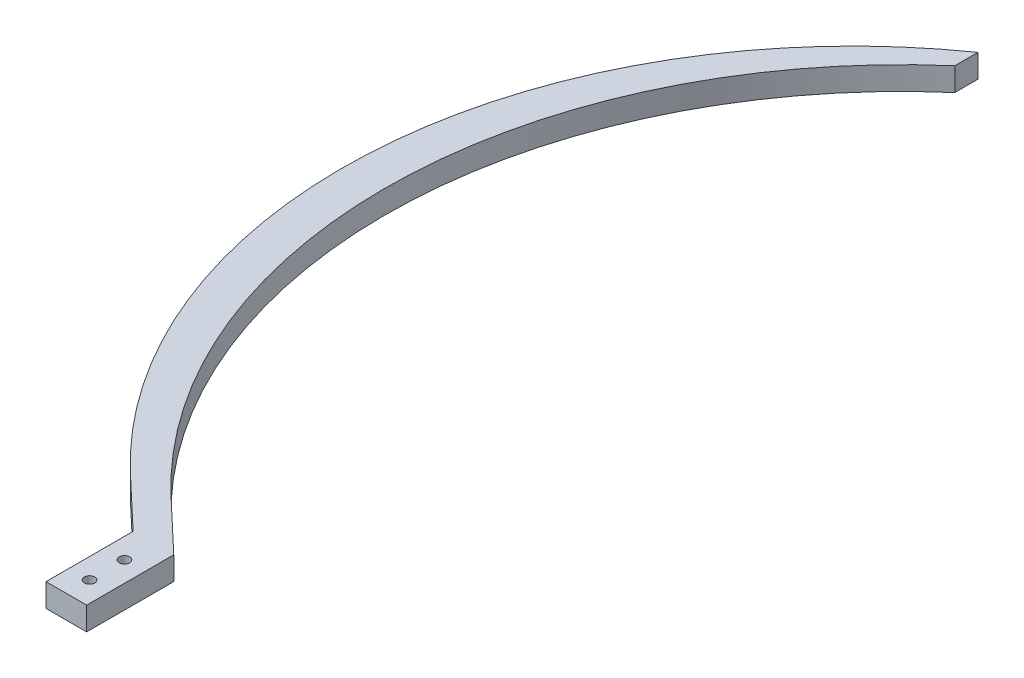
ISO-10303-21;
HEADER;
FILE_DESCRIPTION(('STEP AP214'),'2;1');
FILE_NAME('part.step','',(''),(''),'','','');
FILE_SCHEMA(('AUTOMOTIVE_DESIGN { 1 0 10303 214 1 1 1 1 }'));
ENDSEC;
DATA;
#1=APPLICATION_CONTEXT('core data for automotive mechanical design processes');
#2=APPLICATION_PROTOCOL_DEFINITION('international standard','automotive_design',2000,#1);
#3=PRODUCT_CONTEXT('',#1,'mechanical');
#4=PRODUCT('Part','Part','',(#3));
#5=PRODUCT_RELATED_PRODUCT_CATEGORY('part','',(#4));
#6=PRODUCT_DEFINITION_FORMATION('','',#4);
#7=PRODUCT_DEFINITION_CONTEXT('part definition',#1,'design');
#8=PRODUCT_DEFINITION('design','',#6,#7);
#9=PRODUCT_DEFINITION_SHAPE('','',#8);
#10=(LENGTH_UNIT() NAMED_UNIT(*) SI_UNIT(.MILLI.,.METRE.));
#11=(NAMED_UNIT(*) PLANE_ANGLE_UNIT() SI_UNIT($,.RADIAN.));
#12=(NAMED_UNIT(*) SI_UNIT($,.STERADIAN.) SOLID_ANGLE_UNIT());
#13=UNCERTAINTY_MEASURE_WITH_UNIT(LENGTH_MEASURE(1.E-05),#10,'distance_accuracy_value','');
#14=(GEOMETRIC_REPRESENTATION_CONTEXT(3) GLOBAL_UNCERTAINTY_ASSIGNED_CONTEXT((#13)) GLOBAL_UNIT_ASSIGNED_CONTEXT((#10,
#11,#12)) REPRESENTATION_CONTEXT('',''));
#15=CARTESIAN_POINT('',(0.,0.,0.));
#16=DIRECTION('',(0.,0.,1.));
#17=DIRECTION('',(1.,0.,0.));
#18=AXIS2_PLACEMENT_3D('',#15,#16,#17);
#19=CARTESIAN_POINT('',(48.3233544557668,4.,-79.6272482003296));
#20=DIRECTION('',(0.,-1.,0.));
#21=DIRECTION('',(0.,0.,-1.));
#22=AXIS2_PLACEMENT_3D('',#19,#20,#21);
#23=CYLINDRICAL_SURFACE('',#22,88.);
#24=CARTESIAN_POINT('',(48.3233544557668,0.,-79.6272482003296));
#25=DIRECTION('',(0.,1.,0.));
#26=DIRECTION('',(0.,0.,1.));
#27=AXIS2_PLACEMENT_3D('',#24,#25,#26);
#28=CIRCLE('',#27,88.);
#29=CARTESIAN_POINT('',(-12.2099151949693,0.,-15.7545367705549));
#30=VERTEX_POINT('',#29);
#31=CARTESIAN_POINT('',(-2.18782967453397,0.,-151.687086374966));
#32=VERTEX_POINT('',#31);
#33=EDGE_CURVE('E130',#30,#32,#28,.F.);
#34=ORIENTED_EDGE('',*,*,#33,.F.);
#35=DIRECTION('',(0.,-1.,0.));
#36=VECTOR('',#35,1.);
#37=CARTESIAN_POINT('',(-12.2099151949693,4.,-15.7545367705549));
#38=LINE('',#37,#36);
#39=CARTESIAN_POINT('',(-12.2099151949693,4.,-15.7545367705549));
#40=VERTEX_POINT('',#39);
#41=EDGE_CURVE('E11',#40,#30,#38,.T.);
#42=ORIENTED_EDGE('',*,*,#41,.F.);
#43=CARTESIAN_POINT('',(48.3233544557668,4.,-79.6272482003296));
#44=DIRECTION('',(0.,1.,0.));
#45=DIRECTION('',(0.,0.,1.));
#46=AXIS2_PLACEMENT_3D('',#43,#44,#45);
#47=CIRCLE('',#46,88.);
#48=CARTESIAN_POINT('',(-2.18782967453397,4.,-151.687086374966));
#49=VERTEX_POINT('',#48);
#50=EDGE_CURVE('E150',#40,#49,#47,.F.);
#51=ORIENTED_EDGE('',*,*,#50,.T.);
#52=DIRECTION('',(0.,-1.,0.));
#53=VECTOR('',#52,1.);
#54=CARTESIAN_POINT('',(-2.18782967453397,4.,-151.687086374966));
#55=LINE('',#54,#53);
#56=EDGE_CURVE('E53',#49,#32,#55,.T.);
#57=ORIENTED_EDGE('',*,*,#56,.T.);
#58=EDGE_LOOP('',(#34,#42,#51,#57));
#59=FACE_BOUND('',#58,.T.);
#60=ADVANCED_FACE('F35',(#59),#23,.T.);
#61=CARTESIAN_POINT('',(2.08848294307025,4.,-2.20369838137614));
#62=DIRECTION('',(-0.68787806421291,0.,0.72582626624744));
#63=DIRECTION('',(0.72582626624744,0.,0.68787806421291));
#64=AXIS2_PLACEMENT_3D('',#61,#62,#63);
#65=PLANE('',#64);
#66=DIRECTION('',(-0.72582626624744,0.,-0.68787806421291));
#67=VECTOR('',#66,1.);
#68=CARTESIAN_POINT('',(2.08848294307025,0.,-2.20369838137614));
#69=LINE('',#68,#67);
#70=CARTESIAN_POINT('',(-3.5,0.,-7.5));
#71=VERTEX_POINT('',#70);
#72=EDGE_CURVE('E132',#71,#30,#69,.T.);
#73=ORIENTED_EDGE('',*,*,#72,.F.);
#74=DIRECTION('',(0.,-1.,0.));
#75=VECTOR('',#74,1.);
#76=CARTESIAN_POINT('',(-3.5,4.,-7.5));
#77=LINE('',#76,#75);
#78=CARTESIAN_POINT('',(-3.5,4.,-7.5));
#79=VERTEX_POINT('',#78);
#80=EDGE_CURVE('E44',#79,#71,#77,.T.);
#81=ORIENTED_EDGE('',*,*,#80,.F.);
#82=DIRECTION('',(-0.72582626624744,0.,-0.68787806421291));
#83=VECTOR('',#82,1.);
#84=CARTESIAN_POINT('',(2.08848294307025,4.,-2.20369838137614));
#85=LINE('',#84,#83);
#86=EDGE_CURVE('E173',#79,#40,#85,.T.);
#87=ORIENTED_EDGE('',*,*,#86,.T.);
#88=ORIENTED_EDGE('',*,*,#41,.T.);
#89=EDGE_LOOP('',(#73,#81,#87,#88));
#90=FACE_BOUND('',#89,.T.);
#91=ADVANCED_FACE('F199',(#90),#65,.T.);
#92=CARTESIAN_POINT('',(-3.5,4.,0.));
#93=DIRECTION('',(1.,0.,0.));
#94=DIRECTION('',(0.,0.,-1.));
#95=AXIS2_PLACEMENT_3D('',#92,#93,#94);
#96=PLANE('',#95);
#97=DIRECTION('',(0.,0.,1.));
#98=VECTOR('',#97,1.);
#99=CARTESIAN_POINT('',(-3.5,0.,0.));
#100=LINE('',#99,#98);
#101=CARTESIAN_POINT('',(-3.5,0.,7.5));
#102=VERTEX_POINT('',#101);
#103=EDGE_CURVE('E135',#71,#102,#100,.T.);
#104=ORIENTED_EDGE('',*,*,#103,.T.);
#105=DIRECTION('',(0.,-1.,0.));
#106=VECTOR('',#105,1.);
#107=CARTESIAN_POINT('',(-3.5,4.,7.5));
#108=LINE('',#107,#106);
#109=CARTESIAN_POINT('',(-3.5,4.,7.5));
#110=VERTEX_POINT('',#109);
#111=EDGE_CURVE('E156',#110,#102,#108,.T.);
#112=ORIENTED_EDGE('',*,*,#111,.F.);
#113=DIRECTION('',(0.,0.,1.));
#114=VECTOR('',#113,1.);
#115=CARTESIAN_POINT('',(-3.5,4.,0.));
#116=LINE('',#115,#114);
#117=EDGE_CURVE('E176',#79,#110,#116,.T.);
#118=ORIENTED_EDGE('',*,*,#117,.F.);
#119=ORIENTED_EDGE('',*,*,#80,.T.);
#120=EDGE_LOOP('',(#104,#112,#118,#119));
#121=FACE_BOUND('',#120,.T.);
#122=ADVANCED_FACE('F203',(#121),#96,.F.);
#123=CARTESIAN_POINT('',(0.,4.,7.5));
#124=DIRECTION('',(0.,0.,1.));
#125=DIRECTION('',(1.,0.,0.));
#126=AXIS2_PLACEMENT_3D('',#123,#124,#125);
#127=PLANE('',#126);
#128=DIRECTION('',(-1.,0.,0.));
#129=VECTOR('',#128,1.);
#130=CARTESIAN_POINT('',(0.,0.,7.5));
#131=LINE('',#130,#129);
#132=CARTESIAN_POINT('',(3.5,0.,7.5));
#133=VERTEX_POINT('',#132);
#134=EDGE_CURVE('E138',#133,#102,#131,.T.);
#135=ORIENTED_EDGE('',*,*,#134,.F.);
#136=DIRECTION('',(0.,-1.,0.));
#137=VECTOR('',#136,1.);
#138=CARTESIAN_POINT('',(3.5,4.,7.5));
#139=LINE('',#138,#137);
#140=CARTESIAN_POINT('',(3.5,4.,7.5));
#141=VERTEX_POINT('',#140);
#142=EDGE_CURVE('E154',#141,#133,#139,.T.);
#143=ORIENTED_EDGE('',*,*,#142,.F.);
#144=DIRECTION('',(-1.,0.,0.));
#145=VECTOR('',#144,1.);
#146=CARTESIAN_POINT('',(0.,4.,7.5));
#147=LINE('',#146,#145);
#148=EDGE_CURVE('E178',#141,#110,#147,.T.);
#149=ORIENTED_EDGE('',*,*,#148,.T.);
#150=ORIENTED_EDGE('',*,*,#111,.T.);
#151=EDGE_LOOP('',(#135,#143,#149,#150));
#152=FACE_BOUND('',#151,.T.);
#153=ADVANCED_FACE('F212',(#152),#127,.T.);
#154=CARTESIAN_POINT('',(3.5,4.,0.));
#155=DIRECTION('',(1.,0.,0.));
#156=DIRECTION('',(0.,0.,-1.));
#157=AXIS2_PLACEMENT_3D('',#154,#155,#156);
#158=PLANE('',#157);
#159=DIRECTION('',(0.,0.,1.));
#160=VECTOR('',#159,1.);
#161=CARTESIAN_POINT('',(3.5,0.,0.));
#162=LINE('',#161,#160);
#163=CARTESIAN_POINT('',(3.5,0.,-7.5));
#164=VERTEX_POINT('',#163);
#165=EDGE_CURVE('E141',#164,#133,#162,.T.);
#166=ORIENTED_EDGE('',*,*,#165,.F.);
#167=DIRECTION('',(0.,-1.,0.));
#168=VECTOR('',#167,1.);
#169=CARTESIAN_POINT('',(3.5,4.,-7.5));
#170=LINE('',#169,#168);
#171=CARTESIAN_POINT('',(3.5,4.,-7.5));
#172=VERTEX_POINT('',#171);
#173=EDGE_CURVE('E122',#172,#164,#170,.T.);
#174=ORIENTED_EDGE('',*,*,#173,.F.);
#175=DIRECTION('',(0.,0.,1.));
#176=VECTOR('',#175,1.);
#177=CARTESIAN_POINT('',(3.5,4.,0.));
#178=LINE('',#177,#176);
#179=EDGE_CURVE('E112',#172,#141,#178,.T.);
#180=ORIENTED_EDGE('',*,*,#179,.T.);
#181=ORIENTED_EDGE('',*,*,#142,.T.);
#182=EDGE_LOOP('',(#166,#174,#180,#181));
#183=FACE_BOUND('',#182,.T.);
#184=ADVANCED_FACE('F182',(#183),#158,.T.);
#185=CARTESIAN_POINT('',(5.40071656164735,4.,-5.69865815024435));
#186=DIRECTION('',(-0.68787806421291,0.,0.72582626624744));
#187=DIRECTION('',(0.72582626624744,0.,0.68787806421291));
#188=AXIS2_PLACEMENT_3D('',#185,#186,#187);
#189=PLANE('',#188);
#190=DIRECTION('',(-0.72582626624744,0.,-0.68787806421291));
#191=VECTOR('',#190,1.);
#192=CARTESIAN_POINT('',(5.40071656164735,0.,-5.69865815024435));
#193=LINE('',#192,#191);
#194=CARTESIAN_POINT('',(-5.20991519496927,0.,-15.7545367705549));
#195=VERTEX_POINT('',#194);
#196=EDGE_CURVE('E119',#164,#195,#193,.T.);
#197=ORIENTED_EDGE('',*,*,#196,.T.);
#198=DIRECTION('',(0.,-1.,0.));
#199=VECTOR('',#198,1.);
#200=CARTESIAN_POINT('',(-5.20991519496927,4.,-15.7545367705549));
#201=LINE('',#200,#199);
#202=CARTESIAN_POINT('',(-5.20991519496927,4.,-15.7545367705549));
#203=VERTEX_POINT('',#202);
#204=EDGE_CURVE('E116',#203,#195,#201,.T.);
#205=ORIENTED_EDGE('',*,*,#204,.F.);
#206=DIRECTION('',(-0.72582626624744,0.,-0.68787806421291));
#207=VECTOR('',#206,1.);
#208=CARTESIAN_POINT('',(5.40071656164735,4.,-5.69865815024435));
#209=LINE('',#208,#207);
#210=EDGE_CURVE('E104',#172,#203,#209,.T.);
#211=ORIENTED_EDGE('',*,*,#210,.F.);
#212=ORIENTED_EDGE('',*,*,#173,.T.);
#213=EDGE_LOOP('',(#197,#205,#211,#212));
#214=FACE_BOUND('',#213,.T.);
#215=ADVANCED_FACE('F117',(#214),#189,.F.);
#216=CARTESIAN_POINT('',(56.0112325199798,4.,-80.3530744665771));
#217=DIRECTION('',(0.,-1.,0.));
#218=DIRECTION('',(0.,0.,-1.));
#219=AXIS2_PLACEMENT_3D('',#216,#217,#218);
#220=CYLINDRICAL_SURFACE('',#219,89.);
#221=CARTESIAN_POINT('',(56.0112325199798,0.,-80.3530744665771));
#222=DIRECTION('',(0.,1.,0.));
#223=DIRECTION('',(0.,0.,1.));
#224=AXIS2_PLACEMENT_3D('',#221,#222,#223);
#225=CIRCLE('',#224,89.);
#226=CARTESIAN_POINT('',(-2.18782967453397,0.,-147.687086374966));
#227=VERTEX_POINT('',#226);
#228=EDGE_CURVE('E145',#195,#227,#225,.F.);
#229=ORIENTED_EDGE('',*,*,#228,.T.);
#230=DIRECTION('',(0.,-1.,0.));
#231=VECTOR('',#230,1.);
#232=CARTESIAN_POINT('',(-2.18782967453397,4.,-147.687086374966));
#233=LINE('',#232,#231);
#234=CARTESIAN_POINT('',(-2.18782967453397,4.,-147.687086374966));
#235=VERTEX_POINT('',#234);
#236=EDGE_CURVE('E79',#235,#227,#233,.T.);
#237=ORIENTED_EDGE('',*,*,#236,.F.);
#238=CARTESIAN_POINT('',(56.0112325199798,4.,-80.3530744665771));
#239=DIRECTION('',(0.,1.,0.));
#240=DIRECTION('',(0.,0.,1.));
#241=AXIS2_PLACEMENT_3D('',#238,#239,#240);
#242=CIRCLE('',#241,89.);
#243=EDGE_CURVE('E109',#203,#235,#242,.F.);
#244=ORIENTED_EDGE('',*,*,#243,.F.);
#245=ORIENTED_EDGE('',*,*,#204,.T.);
#246=EDGE_LOOP('',(#229,#237,#244,#245));
#247=FACE_BOUND('',#246,.T.);
#248=ADVANCED_FACE('F124',(#247),#220,.F.);
#249=CARTESIAN_POINT('',(-2.18782967453394,4.,0.));
#250=DIRECTION('',(1.,0.,0.));
#251=DIRECTION('',(0.,0.,-1.));
#252=AXIS2_PLACEMENT_3D('',#249,#250,#251);
#253=PLANE('',#252);
#254=DIRECTION('',(0.,0.,1.));
#255=VECTOR('',#254,1.);
#256=CARTESIAN_POINT('',(-2.18782967453394,0.,0.));
#257=LINE('',#256,#255);
#258=EDGE_CURVE('E147',#32,#227,#257,.T.);
#259=ORIENTED_EDGE('',*,*,#258,.F.);
#260=ORIENTED_EDGE('',*,*,#56,.F.);
#261=DIRECTION('',(0.,0.,1.));
#262=VECTOR('',#261,1.);
#263=CARTESIAN_POINT('',(-2.18782967453394,4.,0.));
#264=LINE('',#263,#262);
#265=EDGE_CURVE('E125',#49,#235,#264,.T.);
#266=ORIENTED_EDGE('',*,*,#265,.T.);
#267=ORIENTED_EDGE('',*,*,#236,.T.);
#268=EDGE_LOOP('',(#259,#260,#266,#267));
#269=FACE_BOUND('',#268,.T.);
#270=ADVANCED_FACE('F186',(#269),#253,.T.);
#271=CARTESIAN_POINT('',(0.,4.,0.));
#272=DIRECTION('',(0.,1.,0.));
#273=DIRECTION('',(0.,0.,1.));
#274=AXIS2_PLACEMENT_3D('',#271,#272,#273);
#275=PLANE('',#274);
#276=CARTESIAN_POINT('',(0.,4.,3.5));
#277=DIRECTION('',(0.,1.,0.));
#278=DIRECTION('',(0.,0.,1.));
#279=AXIS2_PLACEMENT_3D('',#276,#277,#278);
#280=CIRCLE('',#279,0.9);
#281=CARTESIAN_POINT('',(0.,4.,4.4));
#282=VERTEX_POINT('',#281);
#283=EDGE_CURVE('E160',#282,#282,#280,.T.);
#284=ORIENTED_EDGE('',*,*,#283,.F.);
#285=EDGE_LOOP('',(#284));
#286=FACE_BOUND('',#285,.T.);
#287=CARTESIAN_POINT('',(0.,4.,-2.5));
#288=DIRECTION('',(0.,1.,0.));
#289=DIRECTION('',(0.,0.,1.));
#290=AXIS2_PLACEMENT_3D('',#287,#288,#289);
#291=CIRCLE('',#290,0.9);
#292=CARTESIAN_POINT('',(0.,4.,-1.6));
#293=VERTEX_POINT('',#292);
#294=EDGE_CURVE('E165',#293,#293,#291,.T.);
#295=ORIENTED_EDGE('',*,*,#294,.F.);
#296=EDGE_LOOP('',(#295));
#297=FACE_BOUND('',#296,.T.);
#298=ORIENTED_EDGE('',*,*,#50,.F.);
#299=ORIENTED_EDGE('',*,*,#86,.F.);
#300=ORIENTED_EDGE('',*,*,#117,.T.);
#301=ORIENTED_EDGE('',*,*,#148,.F.);
#302=ORIENTED_EDGE('',*,*,#179,.F.);
#303=ORIENTED_EDGE('',*,*,#210,.T.);
#304=ORIENTED_EDGE('',*,*,#243,.T.);
#305=ORIENTED_EDGE('',*,*,#265,.F.);
#306=EDGE_LOOP('',(#298,#299,#300,#301,#302,#303,#304,#305));
#307=FACE_BOUND('',#306,.T.);
#308=ADVANCED_FACE('F106',(#286,#297,#307),#275,.T.);
#309=CARTESIAN_POINT('',(0.,0.,0.));
#310=DIRECTION('',(0.,1.,0.));
#311=DIRECTION('',(0.,0.,1.));
#312=AXIS2_PLACEMENT_3D('',#309,#310,#311);
#313=PLANE('',#312);
#314=CARTESIAN_POINT('',(0.,0.,3.5));
#315=DIRECTION('',(0.,1.,0.));
#316=DIRECTION('',(0.,0.,1.));
#317=AXIS2_PLACEMENT_3D('',#314,#315,#316);
#318=CIRCLE('',#317,0.9);
#319=CARTESIAN_POINT('',(0.,0.,4.4));
#320=VERTEX_POINT('',#319);
#321=EDGE_CURVE('E38',#320,#320,#318,.T.);
#322=ORIENTED_EDGE('',*,*,#321,.T.);
#323=EDGE_LOOP('',(#322));
#324=FACE_BOUND('',#323,.T.);
#325=CARTESIAN_POINT('',(0.,0.,-2.5));
#326=DIRECTION('',(0.,1.,0.));
#327=DIRECTION('',(0.,0.,1.));
#328=AXIS2_PLACEMENT_3D('',#325,#326,#327);
#329=CIRCLE('',#328,0.9);
#330=CARTESIAN_POINT('',(0.,0.,-1.6));
#331=VERTEX_POINT('',#330);
#332=EDGE_CURVE('E158',#331,#331,#329,.T.);
#333=ORIENTED_EDGE('',*,*,#332,.T.);
#334=EDGE_LOOP('',(#333));
#335=FACE_BOUND('',#334,.T.);
#336=ORIENTED_EDGE('',*,*,#33,.T.);
#337=ORIENTED_EDGE('',*,*,#258,.T.);
#338=ORIENTED_EDGE('',*,*,#228,.F.);
#339=ORIENTED_EDGE('',*,*,#196,.F.);
#340=ORIENTED_EDGE('',*,*,#165,.T.);
#341=ORIENTED_EDGE('',*,*,#134,.T.);
#342=ORIENTED_EDGE('',*,*,#103,.F.);
#343=ORIENTED_EDGE('',*,*,#72,.T.);
#344=EDGE_LOOP('',(#336,#337,#338,#339,#340,#341,#342,#343));
#345=FACE_BOUND('',#344,.T.);
#346=ADVANCED_FACE('F185',(#324,#335,#345),#313,.F.);
#347=CARTESIAN_POINT('',(0.,-6.,-2.5));
#348=DIRECTION('',(0.,1.,0.));
#349=DIRECTION('',(0.,0.,1.));
#350=AXIS2_PLACEMENT_3D('',#347,#348,#349);
#351=CYLINDRICAL_SURFACE('',#350,0.9);
#352=ORIENTED_EDGE('',*,*,#294,.T.);
#353=EDGE_LOOP('',(#352));
#354=FACE_BOUND('',#353,.T.);
#355=ORIENTED_EDGE('',*,*,#332,.F.);
#356=EDGE_LOOP('',(#355));
#357=FACE_BOUND('',#356,.T.);
#358=ADVANCED_FACE('F246',(#354,#357),#351,.F.);
#359=CARTESIAN_POINT('',(0.,-6.,3.5));
#360=DIRECTION('',(0.,1.,0.));
#361=DIRECTION('',(0.,0.,1.));
#362=AXIS2_PLACEMENT_3D('',#359,#360,#361);
#363=CYLINDRICAL_SURFACE('',#362,0.9);
#364=ORIENTED_EDGE('',*,*,#283,.T.);
#365=EDGE_LOOP('',(#364));
#366=FACE_BOUND('',#365,.T.);
#367=ORIENTED_EDGE('',*,*,#321,.F.);
#368=EDGE_LOOP('',(#367));
#369=FACE_BOUND('',#368,.T.);
#370=ADVANCED_FACE('F254',(#366,#369),#363,.F.);
#371=CLOSED_SHELL('',(#60,#91,#122,#153,#184,#215,#248,#270,#308,#346,#358,#370));
#372=MANIFOLD_SOLID_BREP('B2',#371);
#373=ADVANCED_BREP_SHAPE_REPRESENTATION('',(#18,#372),#14);
#374=SHAPE_DEFINITION_REPRESENTATION(#9,#373);
ENDSEC;
END-ISO-10303-21;
